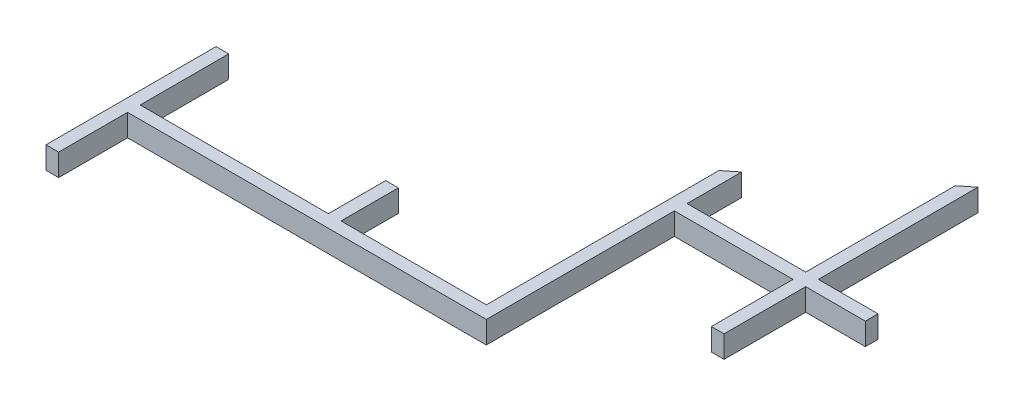
ISO-10303-21;
HEADER;
FILE_DESCRIPTION(('STEP AP214'),'2;1');
FILE_NAME('part.step','',(''),(''),'','','');
FILE_SCHEMA(('AUTOMOTIVE_DESIGN { 1 0 10303 214 1 1 1 1 }'));
ENDSEC;
DATA;
#1=APPLICATION_CONTEXT('core data for automotive mechanical design processes');
#2=APPLICATION_PROTOCOL_DEFINITION('international standard','automotive_design',2000,#1);
#3=PRODUCT_CONTEXT('',#1,'mechanical');
#4=PRODUCT('Part','Part','',(#3));
#5=PRODUCT_RELATED_PRODUCT_CATEGORY('part','',(#4));
#6=PRODUCT_DEFINITION_FORMATION('','',#4);
#7=PRODUCT_DEFINITION_CONTEXT('part definition',#1,'design');
#8=PRODUCT_DEFINITION('design','',#6,#7);
#9=PRODUCT_DEFINITION_SHAPE('','',#8);
#10=(LENGTH_UNIT() NAMED_UNIT(*) SI_UNIT(.MILLI.,.METRE.));
#11=(NAMED_UNIT(*) PLANE_ANGLE_UNIT() SI_UNIT($,.RADIAN.));
#12=(NAMED_UNIT(*) SI_UNIT($,.STERADIAN.) SOLID_ANGLE_UNIT());
#13=UNCERTAINTY_MEASURE_WITH_UNIT(LENGTH_MEASURE(1.E-05),#10,'distance_accuracy_value','');
#14=(GEOMETRIC_REPRESENTATION_CONTEXT(3) GLOBAL_UNCERTAINTY_ASSIGNED_CONTEXT((#13)) GLOBAL_UNIT_ASSIGNED_CONTEXT((#10,
#11,#12)) REPRESENTATION_CONTEXT('',''));
#15=CARTESIAN_POINT('',(0.,0.,0.));
#16=DIRECTION('',(0.,0.,1.));
#17=DIRECTION('',(1.,0.,0.));
#18=AXIS2_PLACEMENT_3D('',#15,#16,#17);
#19=CARTESIAN_POINT('',(40.0618679744798,-0.01,46.4845918549604));
#20=DIRECTION('',(0.624426731607843,0.,0.781083386619858));
#21=DIRECTION('',(0.781083386619858,0.,-0.624426731607843));
#22=AXIS2_PLACEMENT_3D('',#19,#20,#21);
#23=PLANE('',#22);
#24=DIRECTION('',(0.781083386619858,0.,-0.624426731607843));
#25=VECTOR('',#24,1.);
#26=CARTESIAN_POINT('',(38.2923721847623,0.,47.8991917446709));
#27=LINE('',#26,#25);
#28=CARTESIAN_POINT('',(47.3251652677286,0.,40.6780453745054));
#29=VERTEX_POINT('',#28);
#30=CARTESIAN_POINT('',(51.3251652677286,0.,37.48029854079));
#31=VERTEX_POINT('',#30);
#32=EDGE_CURVE('E242',#29,#31,#27,.T.);
#33=ORIENTED_EDGE('',*,*,#32,.F.);
#34=DIRECTION('',(0.,1.,0.));
#35=VECTOR('',#34,1.);
#36=CARTESIAN_POINT('',(47.3251652677286,7.,40.6780453745054));
#37=LINE('',#36,#35);
#38=CARTESIAN_POINT('',(47.3251652677286,7.,40.6780453745054));
#39=VERTEX_POINT('',#38);
#40=EDGE_CURVE('E379',#29,#39,#37,.T.);
#41=ORIENTED_EDGE('',*,*,#40,.T.);
#42=DIRECTION('',(0.781083386619858,0.,-0.624426731607843));
#43=VECTOR('',#42,1.);
#44=CARTESIAN_POINT('',(38.2923721847623,7.,47.8991917446709));
#45=LINE('',#44,#43);
#46=CARTESIAN_POINT('',(51.3251652677286,7.,37.48029854079));
#47=VERTEX_POINT('',#46);
#48=EDGE_CURVE('E50',#39,#47,#45,.T.);
#49=ORIENTED_EDGE('',*,*,#48,.T.);
#50=DIRECTION('',(0.,1.,0.));
#51=VECTOR('',#50,1.);
#52=CARTESIAN_POINT('',(51.3251652677286,7.,37.48029854079));
#53=LINE('',#52,#51);
#54=EDGE_CURVE('E45',#31,#47,#53,.T.);
#55=ORIENTED_EDGE('',*,*,#54,.F.);
#56=EDGE_LOOP('',(#33,#41,#49,#55));
#57=FACE_BOUND('',#56,.T.);
#58=ADVANCED_FACE('F42',(#57),#23,.F.);
#59=CARTESIAN_POINT('',(88.8387773673658,7.,7.49053996257907));
#60=VERTEX_POINT('',#59);
#61=CARTESIAN_POINT('',(92.8387773673658,7.,4.29279312886364));
#62=VERTEX_POINT('',#61);
#63=EDGE_CURVE('E11',#60,#62,#45,.T.);
#64=ORIENTED_EDGE('',*,*,#63,.T.);
#65=DIRECTION('',(0.,-1.,0.));
#66=VECTOR('',#65,1.);
#67=CARTESIAN_POINT('',(92.8387773673658,7.,4.29279312886366));
#68=LINE('',#67,#66);
#69=CARTESIAN_POINT('',(92.8387773673658,0.,4.29279312886364));
#70=VERTEX_POINT('',#69);
#71=EDGE_CURVE('E58',#62,#70,#68,.T.);
#72=ORIENTED_EDGE('',*,*,#71,.T.);
#73=CARTESIAN_POINT('',(88.8387773673658,0.,7.49053996257907));
#74=VERTEX_POINT('',#73);
#75=EDGE_CURVE('E312',#74,#70,#27,.T.);
#76=ORIENTED_EDGE('',*,*,#75,.F.);
#77=DIRECTION('',(0.,-1.,0.));
#78=VECTOR('',#77,1.);
#79=CARTESIAN_POINT('',(88.8387773673658,7.,7.49053996257909));
#80=LINE('',#79,#78);
#81=EDGE_CURVE('E380',#60,#74,#80,.T.);
#82=ORIENTED_EDGE('',*,*,#81,.F.);
#83=EDGE_LOOP('',(#64,#72,#76,#82));
#84=FACE_BOUND('',#83,.T.);
#85=ADVANCED_FACE('F486',(#84),#23,.F.);
#86=CARTESIAN_POINT('',(0.,7.,114.219108150174));
#87=DIRECTION('',(0.,0.,-1.));
#88=DIRECTION('',(-1.,0.,0.));
#89=AXIS2_PLACEMENT_3D('',#86,#87,#88);
#90=PLANE('',#89);
#91=DIRECTION('',(1.,0.,0.));
#92=VECTOR('',#91,1.);
#93=CARTESIAN_POINT('',(0.,0.,114.219108150174));
#94=LINE('',#93,#92);
#95=CARTESIAN_POINT('',(1.39906382550039,0.,114.219108150174));
#96=VERTEX_POINT('',#95);
#97=CARTESIAN_POINT('',(47.3251652677286,0.,114.219108150174));
#98=VERTEX_POINT('',#97);
#99=EDGE_CURVE('E272',#96,#98,#94,.T.);
#100=ORIENTED_EDGE('',*,*,#99,.F.);
#101=DIRECTION('',(0.,-1.,0.));
#102=VECTOR('',#101,1.);
#103=CARTESIAN_POINT('',(1.39906382550039,7.,114.219108150174));
#104=LINE('',#103,#102);
#105=CARTESIAN_POINT('',(1.39906382550039,7.,114.219108150174));
#106=VERTEX_POINT('',#105);
#107=EDGE_CURVE('E401',#106,#96,#104,.T.);
#108=ORIENTED_EDGE('',*,*,#107,.F.);
#109=DIRECTION('',(1.,0.,0.));
#110=VECTOR('',#109,1.);
#111=CARTESIAN_POINT('',(0.,7.,114.219108150174));
#112=LINE('',#111,#110);
#113=CARTESIAN_POINT('',(47.3251652677286,7.,114.219108150174));
#114=VERTEX_POINT('',#113);
#115=EDGE_CURVE('E340',#106,#114,#112,.T.);
#116=ORIENTED_EDGE('',*,*,#115,.T.);
#117=DIRECTION('',(0.,-1.,0.));
#118=VECTOR('',#117,1.);
#119=CARTESIAN_POINT('',(47.3251652677286,7.,114.219108150174));
#120=LINE('',#119,#118);
#121=EDGE_CURVE('E403',#114,#98,#120,.T.);
#122=ORIENTED_EDGE('',*,*,#121,.T.);
#123=EDGE_LOOP('',(#100,#108,#116,#122));
#124=FACE_BOUND('',#123,.T.);
#125=ADVANCED_FACE('F471',(#124),#90,.T.);
#126=CARTESIAN_POINT('',(1.39906382550039,7.,0.));
#127=DIRECTION('',(1.,0.,0.));
#128=DIRECTION('',(0.,0.,-1.));
#129=AXIS2_PLACEMENT_3D('',#126,#127,#128);
#130=PLANE('',#129);
#131=DIRECTION('',(0.,0.,1.));
#132=VECTOR('',#131,1.);
#133=CARTESIAN_POINT('',(1.39906382550039,0.,0.));
#134=LINE('',#133,#132);
#135=CARTESIAN_POINT('',(1.39906382550039,0.,96.1015176169608));
#136=VERTEX_POINT('',#135);
#137=EDGE_CURVE('E269',#136,#96,#134,.T.);
#138=ORIENTED_EDGE('',*,*,#137,.F.);
#139=DIRECTION('',(0.,-1.,0.));
#140=VECTOR('',#139,1.);
#141=CARTESIAN_POINT('',(1.39906382550039,7.,96.1015176169608));
#142=LINE('',#141,#140);
#143=CARTESIAN_POINT('',(1.39906382550039,7.,96.1015176169608));
#144=VERTEX_POINT('',#143);
#145=EDGE_CURVE('E399',#144,#136,#142,.T.);
#146=ORIENTED_EDGE('',*,*,#145,.F.);
#147=DIRECTION('',(0.,0.,1.));
#148=VECTOR('',#147,1.);
#149=CARTESIAN_POINT('',(1.39906382550039,7.,0.));
#150=LINE('',#149,#148);
#151=EDGE_CURVE('E337',#144,#106,#150,.T.);
#152=ORIENTED_EDGE('',*,*,#151,.T.);
#153=ORIENTED_EDGE('',*,*,#107,.T.);
#154=EDGE_LOOP('',(#138,#146,#152,#153));
#155=FACE_BOUND('',#154,.T.);
#156=ADVANCED_FACE('F467',(#155),#130,.T.);
#157=CARTESIAN_POINT('',(0.,7.,96.1015176169608));
#158=DIRECTION('',(0.,0.,-1.));
#159=DIRECTION('',(-1.,0.,0.));
#160=AXIS2_PLACEMENT_3D('',#157,#158,#159);
#161=PLANE('',#160);
#162=DIRECTION('',(1.,0.,0.));
#163=VECTOR('',#162,1.);
#164=CARTESIAN_POINT('',(0.,0.,96.1015176169608));
#165=LINE('',#164,#163);
#166=CARTESIAN_POINT('',(-2.60093617449961,0.,96.1015176169608));
#167=VERTEX_POINT('',#166);
#168=EDGE_CURVE('E266',#167,#136,#165,.T.);
#169=ORIENTED_EDGE('',*,*,#168,.F.);
#170=DIRECTION('',(0.,-1.,0.));
#171=VECTOR('',#170,1.);
#172=CARTESIAN_POINT('',(-2.60093617449961,7.,96.1015176169608));
#173=LINE('',#172,#171);
#174=CARTESIAN_POINT('',(-2.60093617449961,7.,96.1015176169608));
#175=VERTEX_POINT('',#174);
#176=EDGE_CURVE('E397',#175,#167,#173,.T.);
#177=ORIENTED_EDGE('',*,*,#176,.F.);
#178=DIRECTION('',(1.,0.,0.));
#179=VECTOR('',#178,1.);
#180=CARTESIAN_POINT('',(0.,7.,96.1015176169608));
#181=LINE('',#180,#179);
#182=EDGE_CURVE('E334',#175,#144,#181,.T.);
#183=ORIENTED_EDGE('',*,*,#182,.T.);
#184=ORIENTED_EDGE('',*,*,#145,.T.);
#185=EDGE_LOOP('',(#169,#177,#183,#184));
#186=FACE_BOUND('',#185,.T.);
#187=ADVANCED_FACE('F463',(#186),#161,.T.);
#188=CARTESIAN_POINT('',(-2.60093617449961,7.,0.));
#189=DIRECTION('',(-1.,0.,0.));
#190=DIRECTION('',(0.,0.,1.));
#191=AXIS2_PLACEMENT_3D('',#188,#189,#190);
#192=PLANE('',#191);
#193=DIRECTION('',(0.,0.,-1.));
#194=VECTOR('',#193,1.);
#195=CARTESIAN_POINT('',(-2.60093617449961,0.,0.));
#196=LINE('',#195,#194);
#197=CARTESIAN_POINT('',(-2.60093617449961,0.,114.219108150174));
#198=VERTEX_POINT('',#197);
#199=EDGE_CURVE('E263',#198,#167,#196,.T.);
#200=ORIENTED_EDGE('',*,*,#199,.F.);
#201=DIRECTION('',(0.,-1.,0.));
#202=VECTOR('',#201,1.);
#203=CARTESIAN_POINT('',(-2.60093617449961,7.,114.219108150174));
#204=LINE('',#203,#202);
#205=CARTESIAN_POINT('',(-2.60093617449961,7.,114.219108150174));
#206=VERTEX_POINT('',#205);
#207=EDGE_CURVE('E395',#206,#198,#204,.T.);
#208=ORIENTED_EDGE('',*,*,#207,.F.);
#209=DIRECTION('',(0.,0.,-1.));
#210=VECTOR('',#209,1.);
#211=CARTESIAN_POINT('',(-2.60093617449961,7.,0.));
#212=LINE('',#211,#210);
#213=EDGE_CURVE('E331',#206,#175,#212,.T.);
#214=ORIENTED_EDGE('',*,*,#213,.T.);
#215=ORIENTED_EDGE('',*,*,#176,.T.);
#216=EDGE_LOOP('',(#200,#208,#214,#215));
#217=FACE_BOUND('',#216,.T.);
#218=ADVANCED_FACE('F459',(#217),#192,.T.);
#219=CARTESIAN_POINT('',(0.,7.,114.219108150174));
#220=DIRECTION('',(0.,0.,-1.));
#221=DIRECTION('',(-1.,0.,0.));
#222=AXIS2_PLACEMENT_3D('',#219,#220,#221);
#223=PLANE('',#222);
#224=DIRECTION('',(1.,0.,0.));
#225=VECTOR('',#224,1.);
#226=CARTESIAN_POINT('',(0.,0.,114.219108150174));
#227=LINE('',#226,#225);
#228=CARTESIAN_POINT('',(-62.0964416968495,0.,114.219108150174));
#229=VERTEX_POINT('',#228);
#230=EDGE_CURVE('E260',#229,#198,#227,.T.);
#231=ORIENTED_EDGE('',*,*,#230,.F.);
#232=DIRECTION('',(0.,-1.,0.));
#233=VECTOR('',#232,1.);
#234=CARTESIAN_POINT('',(-62.0964416968495,7.,114.219108150174));
#235=LINE('',#234,#233);
#236=CARTESIAN_POINT('',(-62.0964416968495,7.,114.219108150174));
#237=VERTEX_POINT('',#236);
#238=EDGE_CURVE('E393',#237,#229,#235,.T.);
#239=ORIENTED_EDGE('',*,*,#238,.F.);
#240=DIRECTION('',(1.,0.,0.));
#241=VECTOR('',#240,1.);
#242=CARTESIAN_POINT('',(0.,7.,114.219108150174));
#243=LINE('',#242,#241);
#244=EDGE_CURVE('E328',#237,#206,#243,.T.);
#245=ORIENTED_EDGE('',*,*,#244,.T.);
#246=ORIENTED_EDGE('',*,*,#207,.T.);
#247=EDGE_LOOP('',(#231,#239,#245,#246));
#248=FACE_BOUND('',#247,.T.);
#249=ADVANCED_FACE('F455',(#248),#223,.T.);
#250=CARTESIAN_POINT('',(-62.0964416968495,7.,0.));
#251=DIRECTION('',(1.,0.,0.));
#252=DIRECTION('',(0.,0.,-1.));
#253=AXIS2_PLACEMENT_3D('',#250,#251,#252);
#254=PLANE('',#253);
#255=DIRECTION('',(0.,0.,1.));
#256=VECTOR('',#255,1.);
#257=CARTESIAN_POINT('',(-62.0964416968495,0.,0.));
#258=LINE('',#257,#256);
#259=CARTESIAN_POINT('',(-62.0964416968495,0.,86.2448382475305));
#260=VERTEX_POINT('',#259);
#261=EDGE_CURVE('E257',#260,#229,#258,.T.);
#262=ORIENTED_EDGE('',*,*,#261,.F.);
#263=DIRECTION('',(0.,-1.,0.));
#264=VECTOR('',#263,1.);
#265=CARTESIAN_POINT('',(-62.0964416968495,7.,86.2448382475305));
#266=LINE('',#265,#264);
#267=CARTESIAN_POINT('',(-62.0964416968495,7.,86.2448382475305));
#268=VERTEX_POINT('',#267);
#269=EDGE_CURVE('E391',#268,#260,#266,.T.);
#270=ORIENTED_EDGE('',*,*,#269,.F.);
#271=DIRECTION('',(0.,0.,1.));
#272=VECTOR('',#271,1.);
#273=CARTESIAN_POINT('',(-62.0964416968495,7.,0.));
#274=LINE('',#273,#272);
#275=EDGE_CURVE('E325',#268,#237,#274,.T.);
#276=ORIENTED_EDGE('',*,*,#275,.T.);
#277=ORIENTED_EDGE('',*,*,#238,.T.);
#278=EDGE_LOOP('',(#262,#270,#276,#277));
#279=FACE_BOUND('',#278,.T.);
#280=ADVANCED_FACE('F451',(#279),#254,.T.);
#281=CARTESIAN_POINT('',(0.,7.,86.2448382475305));
#282=DIRECTION('',(0.,0.,-1.));
#283=DIRECTION('',(-1.,0.,0.));
#284=AXIS2_PLACEMENT_3D('',#281,#282,#283);
#285=PLANE('',#284);
#286=DIRECTION('',(1.,0.,0.));
#287=VECTOR('',#286,1.);
#288=CARTESIAN_POINT('',(0.,0.,86.2448382475305));
#289=LINE('',#288,#287);
#290=CARTESIAN_POINT('',(-66.0964416968495,0.,86.2448382475305));
#291=VERTEX_POINT('',#290);
#292=EDGE_CURVE('E254',#291,#260,#289,.T.);
#293=ORIENTED_EDGE('',*,*,#292,.F.);
#294=DIRECTION('',(0.,-1.,0.));
#295=VECTOR('',#294,1.);
#296=CARTESIAN_POINT('',(-66.0964416968495,7.,86.2448382475305));
#297=LINE('',#296,#295);
#298=CARTESIAN_POINT('',(-66.0964416968495,7.,86.2448382475305));
#299=VERTEX_POINT('',#298);
#300=EDGE_CURVE('E389',#299,#291,#297,.T.);
#301=ORIENTED_EDGE('',*,*,#300,.F.);
#302=DIRECTION('',(1.,0.,0.));
#303=VECTOR('',#302,1.);
#304=CARTESIAN_POINT('',(0.,7.,86.2448382475305));
#305=LINE('',#304,#303);
#306=EDGE_CURVE('E322',#299,#268,#305,.T.);
#307=ORIENTED_EDGE('',*,*,#306,.T.);
#308=ORIENTED_EDGE('',*,*,#269,.T.);
#309=EDGE_LOOP('',(#293,#301,#307,#308));
#310=FACE_BOUND('',#309,.T.);
#311=ADVANCED_FACE('F449',(#310),#285,.T.);
#312=CARTESIAN_POINT('',(-66.0964416968495,7.,0.));
#313=DIRECTION('',(-1.,0.,0.));
#314=DIRECTION('',(0.,0.,1.));
#315=AXIS2_PLACEMENT_3D('',#312,#313,#314);
#316=PLANE('',#315);
#317=DIRECTION('',(0.,0.,-1.));
#318=VECTOR('',#317,1.);
#319=CARTESIAN_POINT('',(-66.0964416968495,0.,0.));
#320=LINE('',#319,#318);
#321=CARTESIAN_POINT('',(-66.0964416968495,0.,140.));
#322=VERTEX_POINT('',#321);
#323=EDGE_CURVE('E251',#322,#291,#320,.T.);
#324=ORIENTED_EDGE('',*,*,#323,.F.);
#325=DIRECTION('',(0.,-1.,0.));
#326=VECTOR('',#325,1.);
#327=CARTESIAN_POINT('',(-66.0964416968495,7.,140.));
#328=LINE('',#327,#326);
#329=CARTESIAN_POINT('',(-66.0964416968495,7.,140.));
#330=VERTEX_POINT('',#329);
#331=EDGE_CURVE('E315',#330,#322,#328,.T.);
#332=ORIENTED_EDGE('',*,*,#331,.F.);
#333=DIRECTION('',(0.,0.,-1.));
#334=VECTOR('',#333,1.);
#335=CARTESIAN_POINT('',(-66.0964416968495,7.,0.));
#336=LINE('',#335,#334);
#337=EDGE_CURVE('E319',#330,#299,#336,.T.);
#338=ORIENTED_EDGE('',*,*,#337,.T.);
#339=ORIENTED_EDGE('',*,*,#300,.T.);
#340=EDGE_LOOP('',(#324,#332,#338,#339));
#341=FACE_BOUND('',#340,.T.);
#342=ADVANCED_FACE('F445',(#341),#316,.T.);
#343=CARTESIAN_POINT('',(0.,7.,140.));
#344=DIRECTION('',(0.,0.,1.));
#345=DIRECTION('',(1.,0.,0.));
#346=AXIS2_PLACEMENT_3D('',#343,#344,#345);
#347=PLANE('',#346);
#348=DIRECTION('',(-1.,0.,0.));
#349=VECTOR('',#348,1.);
#350=CARTESIAN_POINT('',(0.,0.,140.));
#351=LINE('',#350,#349);
#352=CARTESIAN_POINT('',(-62.0964416968495,0.,140.));
#353=VERTEX_POINT('',#352);
#354=EDGE_CURVE('E309',#353,#322,#351,.T.);
#355=ORIENTED_EDGE('',*,*,#354,.F.);
#356=DIRECTION('',(0.,-1.,0.));
#357=VECTOR('',#356,1.);
#358=CARTESIAN_POINT('',(-62.0964416968495,7.,140.));
#359=LINE('',#358,#357);
#360=CARTESIAN_POINT('',(-62.0964416968495,7.,140.));
#361=VERTEX_POINT('',#360);
#362=EDGE_CURVE('E236',#361,#353,#359,.T.);
#363=ORIENTED_EDGE('',*,*,#362,.F.);
#364=DIRECTION('',(-1.,0.,0.));
#365=VECTOR('',#364,1.);
#366=CARTESIAN_POINT('',(0.,7.,140.));
#367=LINE('',#366,#365);
#368=EDGE_CURVE('E243',#361,#330,#367,.T.);
#369=ORIENTED_EDGE('',*,*,#368,.T.);
#370=ORIENTED_EDGE('',*,*,#331,.T.);
#371=EDGE_LOOP('',(#355,#363,#369,#370));
#372=FACE_BOUND('',#371,.T.);
#373=ADVANCED_FACE('F433',(#372),#347,.T.);
#374=CARTESIAN_POINT('',(-62.0964416968495,7.,0.));
#375=DIRECTION('',(1.,0.,0.));
#376=DIRECTION('',(0.,0.,-1.));
#377=AXIS2_PLACEMENT_3D('',#374,#375,#376);
#378=PLANE('',#377);
#379=DIRECTION('',(0.,0.,1.));
#380=VECTOR('',#379,1.);
#381=CARTESIAN_POINT('',(-62.0964416968495,0.,0.));
#382=LINE('',#381,#380);
#383=CARTESIAN_POINT('',(-62.0964416968495,0.,118.219108150174));
#384=VERTEX_POINT('',#383);
#385=EDGE_CURVE('E306',#384,#353,#382,.T.);
#386=ORIENTED_EDGE('',*,*,#385,.F.);
#387=DIRECTION('',(0.,-1.,0.));
#388=VECTOR('',#387,1.);
#389=CARTESIAN_POINT('',(-62.0964416968495,7.,118.219108150174));
#390=LINE('',#389,#388);
#391=CARTESIAN_POINT('',(-62.0964416968495,7.,118.219108150174));
#392=VERTEX_POINT('',#391);
#393=EDGE_CURVE('E424',#392,#384,#390,.T.);
#394=ORIENTED_EDGE('',*,*,#393,.F.);
#395=DIRECTION('',(0.,0.,1.));
#396=VECTOR('',#395,1.);
#397=CARTESIAN_POINT('',(-62.0964416968495,7.,0.));
#398=LINE('',#397,#396);
#399=EDGE_CURVE('E246',#392,#361,#398,.T.);
#400=ORIENTED_EDGE('',*,*,#399,.T.);
#401=ORIENTED_EDGE('',*,*,#362,.T.);
#402=EDGE_LOOP('',(#386,#394,#400,#401));
#403=FACE_BOUND('',#402,.T.);
#404=ADVANCED_FACE('F429',(#403),#378,.T.);
#405=CARTESIAN_POINT('',(0.,7.,118.219108150174));
#406=DIRECTION('',(0.,0.,1.));
#407=DIRECTION('',(1.,0.,0.));
#408=AXIS2_PLACEMENT_3D('',#405,#406,#407);
#409=PLANE('',#408);
#410=DIRECTION('',(-1.,0.,0.));
#411=VECTOR('',#410,1.);
#412=CARTESIAN_POINT('',(0.,0.,118.219108150174));
#413=LINE('',#412,#411);
#414=CARTESIAN_POINT('',(51.3251652677286,0.,118.219108150174));
#415=VERTEX_POINT('',#414);
#416=EDGE_CURVE('E303',#415,#384,#413,.T.);
#417=ORIENTED_EDGE('',*,*,#416,.F.);
#418=DIRECTION('',(0.,-1.,0.));
#419=VECTOR('',#418,1.);
#420=CARTESIAN_POINT('',(51.3251652677286,7.,118.219108150174));
#421=LINE('',#420,#419);
#422=CARTESIAN_POINT('',(51.3251652677286,7.,118.219108150174));
#423=VERTEX_POINT('',#422);
#424=EDGE_CURVE('E422',#423,#415,#421,.T.);
#425=ORIENTED_EDGE('',*,*,#424,.F.);
#426=DIRECTION('',(-1.,0.,0.));
#427=VECTOR('',#426,1.);
#428=CARTESIAN_POINT('',(0.,7.,118.219108150174));
#429=LINE('',#428,#427);
#430=EDGE_CURVE('E372',#423,#392,#429,.T.);
#431=ORIENTED_EDGE('',*,*,#430,.T.);
#432=ORIENTED_EDGE('',*,*,#393,.T.);
#433=EDGE_LOOP('',(#417,#425,#431,#432));
#434=FACE_BOUND('',#433,.T.);
#435=ADVANCED_FACE('F438',(#434),#409,.T.);
#436=CARTESIAN_POINT('',(51.3251652677286,7.,0.));
#437=DIRECTION('',(1.,0.,0.));
#438=DIRECTION('',(0.,0.,-1.));
#439=AXIS2_PLACEMENT_3D('',#436,#437,#438);
#440=PLANE('',#439);
#441=DIRECTION('',(0.,0.,1.));
#442=VECTOR('',#441,1.);
#443=CARTESIAN_POINT('',(51.3251652677286,0.,0.));
#444=LINE('',#443,#442);
#445=CARTESIAN_POINT('',(51.3251652677286,0.,58.7665459719618));
#446=VERTEX_POINT('',#445);
#447=EDGE_CURVE('E300',#446,#415,#444,.T.);
#448=ORIENTED_EDGE('',*,*,#447,.F.);
#449=DIRECTION('',(0.,-1.,0.));
#450=VECTOR('',#449,1.);
#451=CARTESIAN_POINT('',(51.3251652677286,7.,58.7665459719618));
#452=LINE('',#451,#450);
#453=CARTESIAN_POINT('',(51.3251652677286,7.,58.7665459719618));
#454=VERTEX_POINT('',#453);
#455=EDGE_CURVE('E420',#454,#446,#452,.T.);
#456=ORIENTED_EDGE('',*,*,#455,.F.);
#457=DIRECTION('',(0.,0.,1.));
#458=VECTOR('',#457,1.);
#459=CARTESIAN_POINT('',(51.3251652677286,7.,0.));
#460=LINE('',#459,#458);
#461=EDGE_CURVE('E369',#454,#423,#460,.T.);
#462=ORIENTED_EDGE('',*,*,#461,.T.);
#463=ORIENTED_EDGE('',*,*,#424,.T.);
#464=EDGE_LOOP('',(#448,#456,#462,#463));
#465=FACE_BOUND('',#464,.T.);
#466=ADVANCED_FACE('F577',(#465),#440,.T.);
#467=CARTESIAN_POINT('',(0.,7.,58.7665459719618));
#468=DIRECTION('',(0.,0.,1.));
#469=DIRECTION('',(1.,0.,0.));
#470=AXIS2_PLACEMENT_3D('',#467,#468,#469);
#471=PLANE('',#470);
#472=DIRECTION('',(-1.,0.,0.));
#473=VECTOR('',#472,1.);
#474=CARTESIAN_POINT('',(0.,0.,58.7665459719618));
#475=LINE('',#474,#473);
#476=CARTESIAN_POINT('',(88.8387773673658,0.,58.7665459719618));
#477=VERTEX_POINT('',#476);
#478=EDGE_CURVE('E297',#477,#446,#475,.T.);
#479=ORIENTED_EDGE('',*,*,#478,.F.);
#480=DIRECTION('',(0.,-1.,0.));
#481=VECTOR('',#480,1.);
#482=CARTESIAN_POINT('',(88.8387773673658,7.,58.7665459719618));
#483=LINE('',#482,#481);
#484=CARTESIAN_POINT('',(88.8387773673658,7.,58.7665459719618));
#485=VERTEX_POINT('',#484);
#486=EDGE_CURVE('E418',#485,#477,#483,.T.);
#487=ORIENTED_EDGE('',*,*,#486,.F.);
#488=DIRECTION('',(-1.,0.,0.));
#489=VECTOR('',#488,1.);
#490=CARTESIAN_POINT('',(0.,7.,58.7665459719618));
#491=LINE('',#490,#489);
#492=EDGE_CURVE('E366',#485,#454,#491,.T.);
#493=ORIENTED_EDGE('',*,*,#492,.T.);
#494=ORIENTED_EDGE('',*,*,#455,.T.);
#495=EDGE_LOOP('',(#479,#487,#493,#494));
#496=FACE_BOUND('',#495,.T.);
#497=ADVANCED_FACE('F585',(#496),#471,.T.);
#498=CARTESIAN_POINT('',(88.8387773673657,7.,0.));
#499=DIRECTION('',(-1.,0.,0.));
#500=DIRECTION('',(0.,0.,1.));
#501=AXIS2_PLACEMENT_3D('',#498,#499,#500);
#502=PLANE('',#501);
#503=DIRECTION('',(0.,0.,-1.));
#504=VECTOR('',#503,1.);
#505=CARTESIAN_POINT('',(88.8387773673657,0.,0.));
#506=LINE('',#505,#504);
#507=CARTESIAN_POINT('',(88.8387773673658,0.,84.5818118750103));
#508=VERTEX_POINT('',#507);
#509=EDGE_CURVE('E294',#508,#477,#506,.T.);
#510=ORIENTED_EDGE('',*,*,#509,.F.);
#511=DIRECTION('',(0.,-1.,0.));
#512=VECTOR('',#511,1.);
#513=CARTESIAN_POINT('',(88.8387773673658,7.,84.5818118750103));
#514=LINE('',#513,#512);
#515=CARTESIAN_POINT('',(88.8387773673658,7.,84.5818118750103));
#516=VERTEX_POINT('',#515);
#517=EDGE_CURVE('E416',#516,#508,#514,.T.);
#518=ORIENTED_EDGE('',*,*,#517,.F.);
#519=DIRECTION('',(0.,0.,-1.));
#520=VECTOR('',#519,1.);
#521=CARTESIAN_POINT('',(88.8387773673657,7.,0.));
#522=LINE('',#521,#520);
#523=EDGE_CURVE('E363',#516,#485,#522,.T.);
#524=ORIENTED_EDGE('',*,*,#523,.T.);
#525=ORIENTED_EDGE('',*,*,#486,.T.);
#526=EDGE_LOOP('',(#510,#518,#524,#525));
#527=FACE_BOUND('',#526,.T.);
#528=ADVANCED_FACE('F594',(#527),#502,.T.);
#529=CARTESIAN_POINT('',(0.,7.,84.5818118750103));
#530=DIRECTION('',(0.,0.,1.));
#531=DIRECTION('',(1.,0.,0.));
#532=AXIS2_PLACEMENT_3D('',#529,#530,#531);
#533=PLANE('',#532);
#534=DIRECTION('',(-1.,0.,0.));
#535=VECTOR('',#534,1.);
#536=CARTESIAN_POINT('',(0.,0.,84.5818118750103));
#537=LINE('',#536,#535);
#538=CARTESIAN_POINT('',(92.8387773673658,0.,84.5818118750103));
#539=VERTEX_POINT('',#538);
#540=EDGE_CURVE('E291',#539,#508,#537,.T.);
#541=ORIENTED_EDGE('',*,*,#540,.F.);
#542=DIRECTION('',(0.,-1.,0.));
#543=VECTOR('',#542,1.);
#544=CARTESIAN_POINT('',(92.8387773673658,7.,84.5818118750103));
#545=LINE('',#544,#543);
#546=CARTESIAN_POINT('',(92.8387773673658,7.,84.5818118750103));
#547=VERTEX_POINT('',#546);
#548=EDGE_CURVE('E414',#547,#539,#545,.T.);
#549=ORIENTED_EDGE('',*,*,#548,.F.);
#550=DIRECTION('',(-1.,0.,0.));
#551=VECTOR('',#550,1.);
#552=CARTESIAN_POINT('',(0.,7.,84.5818118750103));
#553=LINE('',#552,#551);
#554=EDGE_CURVE('E360',#547,#516,#553,.T.);
#555=ORIENTED_EDGE('',*,*,#554,.T.);
#556=ORIENTED_EDGE('',*,*,#517,.T.);
#557=EDGE_LOOP('',(#541,#549,#555,#556));
#558=FACE_BOUND('',#557,.T.);
#559=ADVANCED_FACE('F603',(#558),#533,.T.);
#560=CARTESIAN_POINT('',(92.8387773673658,7.,0.));
#561=DIRECTION('',(1.,0.,0.));
#562=DIRECTION('',(0.,0.,-1.));
#563=AXIS2_PLACEMENT_3D('',#560,#561,#562);
#564=PLANE('',#563);
#565=DIRECTION('',(0.,0.,1.));
#566=VECTOR('',#565,1.);
#567=CARTESIAN_POINT('',(92.8387773673658,0.,0.));
#568=LINE('',#567,#566);
#569=CARTESIAN_POINT('',(92.8387773673658,0.,58.7665459719618));
#570=VERTEX_POINT('',#569);
#571=EDGE_CURVE('E288',#570,#539,#568,.T.);
#572=ORIENTED_EDGE('',*,*,#571,.F.);
#573=DIRECTION('',(0.,-1.,0.));
#574=VECTOR('',#573,1.);
#575=CARTESIAN_POINT('',(92.8387773673658,7.,58.7665459719618));
#576=LINE('',#575,#574);
#577=CARTESIAN_POINT('',(92.8387773673658,7.,58.7665459719618));
#578=VERTEX_POINT('',#577);
#579=EDGE_CURVE('E412',#578,#570,#576,.T.);
#580=ORIENTED_EDGE('',*,*,#579,.F.);
#581=DIRECTION('',(0.,0.,1.));
#582=VECTOR('',#581,1.);
#583=CARTESIAN_POINT('',(92.8387773673658,7.,0.));
#584=LINE('',#583,#582);
#585=EDGE_CURVE('E357',#578,#547,#584,.T.);
#586=ORIENTED_EDGE('',*,*,#585,.T.);
#587=ORIENTED_EDGE('',*,*,#548,.T.);
#588=EDGE_LOOP('',(#572,#580,#586,#587));
#589=FACE_BOUND('',#588,.T.);
#590=ADVANCED_FACE('F612',(#589),#564,.T.);
#591=CARTESIAN_POINT('',(0.,7.,58.7665459719618));
#592=DIRECTION('',(0.,0.,1.));
#593=DIRECTION('',(1.,0.,0.));
#594=AXIS2_PLACEMENT_3D('',#591,#592,#593);
#595=PLANE('',#594);
#596=DIRECTION('',(-1.,0.,0.));
#597=VECTOR('',#596,1.);
#598=CARTESIAN_POINT('',(0.,0.,58.7665459719618));
#599=LINE('',#598,#597);
#600=CARTESIAN_POINT('',(111.70281367071,0.,58.7665459719618));
#601=VERTEX_POINT('',#600);
#602=EDGE_CURVE('E285',#601,#570,#599,.T.);
#603=ORIENTED_EDGE('',*,*,#602,.F.);
#604=DIRECTION('',(0.,-1.,0.));
#605=VECTOR('',#604,1.);
#606=CARTESIAN_POINT('',(111.70281367071,7.,58.7665459719618));
#607=LINE('',#606,#605);
#608=CARTESIAN_POINT('',(111.70281367071,7.,58.7665459719618));
#609=VERTEX_POINT('',#608);
#610=EDGE_CURVE('E410',#609,#601,#607,.T.);
#611=ORIENTED_EDGE('',*,*,#610,.F.);
#612=DIRECTION('',(-1.,0.,0.));
#613=VECTOR('',#612,1.);
#614=CARTESIAN_POINT('',(0.,7.,58.7665459719618));
#615=LINE('',#614,#613);
#616=EDGE_CURVE('E354',#609,#578,#615,.T.);
#617=ORIENTED_EDGE('',*,*,#616,.T.);
#618=ORIENTED_EDGE('',*,*,#579,.T.);
#619=EDGE_LOOP('',(#603,#611,#617,#618));
#620=FACE_BOUND('',#619,.T.);
#621=ADVANCED_FACE('F621',(#620),#595,.T.);
#622=CARTESIAN_POINT('',(111.70281367071,7.,0.));
#623=DIRECTION('',(1.,0.,0.));
#624=DIRECTION('',(0.,0.,-1.));
#625=AXIS2_PLACEMENT_3D('',#622,#623,#624);
#626=PLANE('',#625);
#627=DIRECTION('',(0.,0.,1.));
#628=VECTOR('',#627,1.);
#629=CARTESIAN_POINT('',(111.70281367071,0.,0.));
#630=LINE('',#629,#628);
#631=CARTESIAN_POINT('',(111.70281367071,0.,54.7665459719618));
#632=VERTEX_POINT('',#631);
#633=EDGE_CURVE('E282',#632,#601,#630,.T.);
#634=ORIENTED_EDGE('',*,*,#633,.F.);
#635=DIRECTION('',(0.,-1.,0.));
#636=VECTOR('',#635,1.);
#637=CARTESIAN_POINT('',(111.70281367071,7.,54.7665459719618));
#638=LINE('',#637,#636);
#639=CARTESIAN_POINT('',(111.70281367071,7.,54.7665459719618));
#640=VERTEX_POINT('',#639);
#641=EDGE_CURVE('E408',#640,#632,#638,.T.);
#642=ORIENTED_EDGE('',*,*,#641,.F.);
#643=DIRECTION('',(0.,0.,1.));
#644=VECTOR('',#643,1.);
#645=CARTESIAN_POINT('',(111.70281367071,7.,0.));
#646=LINE('',#645,#644);
#647=EDGE_CURVE('E351',#640,#609,#646,.T.);
#648=ORIENTED_EDGE('',*,*,#647,.T.);
#649=ORIENTED_EDGE('',*,*,#610,.T.);
#650=EDGE_LOOP('',(#634,#642,#648,#649));
#651=FACE_BOUND('',#650,.T.);
#652=ADVANCED_FACE('F630',(#651),#626,.T.);
#653=CARTESIAN_POINT('',(0.,7.,54.7665459719618));
#654=DIRECTION('',(0.,0.,-1.));
#655=DIRECTION('',(-1.,0.,0.));
#656=AXIS2_PLACEMENT_3D('',#653,#654,#655);
#657=PLANE('',#656);
#658=DIRECTION('',(1.,0.,0.));
#659=VECTOR('',#658,1.);
#660=CARTESIAN_POINT('',(0.,0.,54.7665459719618));
#661=LINE('',#660,#659);
#662=CARTESIAN_POINT('',(92.8387773673658,0.,54.7665459719618));
#663=VERTEX_POINT('',#662);
#664=EDGE_CURVE('E279',#663,#632,#661,.T.);
#665=ORIENTED_EDGE('',*,*,#664,.F.);
#666=DIRECTION('',(0.,-1.,0.));
#667=VECTOR('',#666,1.);
#668=CARTESIAN_POINT('',(92.8387773673658,7.,54.7665459719618));
#669=LINE('',#668,#667);
#670=CARTESIAN_POINT('',(92.8387773673658,7.,54.7665459719618));
#671=VERTEX_POINT('',#670);
#672=EDGE_CURVE('E405',#671,#663,#669,.T.);
#673=ORIENTED_EDGE('',*,*,#672,.F.);
#674=DIRECTION('',(1.,0.,0.));
#675=VECTOR('',#674,1.);
#676=CARTESIAN_POINT('',(0.,7.,54.7665459719618));
#677=LINE('',#676,#675);
#678=EDGE_CURVE('E348',#671,#640,#677,.T.);
#679=ORIENTED_EDGE('',*,*,#678,.T.);
#680=ORIENTED_EDGE('',*,*,#641,.T.);
#681=EDGE_LOOP('',(#665,#673,#679,#680));
#682=FACE_BOUND('',#681,.T.);
#683=ADVANCED_FACE('F639',(#682),#657,.T.);
#684=CARTESIAN_POINT('',(92.8387773673658,7.,0.));
#685=DIRECTION('',(1.,0.,0.));
#686=DIRECTION('',(0.,0.,-1.));
#687=AXIS2_PLACEMENT_3D('',#684,#685,#686);
#688=PLANE('',#687);
#689=ORIENTED_EDGE('',*,*,#71,.F.);
#690=DIRECTION('',(0.,0.,1.));
#691=VECTOR('',#690,1.);
#692=CARTESIAN_POINT('',(92.8387773673658,7.,0.));
#693=LINE('',#692,#691);
#694=EDGE_CURVE('E346',#62,#671,#693,.T.);
#695=ORIENTED_EDGE('',*,*,#694,.T.);
#696=ORIENTED_EDGE('',*,*,#672,.T.);
#697=DIRECTION('',(0.,0.,1.));
#698=VECTOR('',#697,1.);
#699=CARTESIAN_POINT('',(92.8387773673658,0.,0.));
#700=LINE('',#699,#698);
#701=EDGE_CURVE('E277',#70,#663,#700,.T.);
#702=ORIENTED_EDGE('',*,*,#701,.F.);
#703=EDGE_LOOP('',(#689,#695,#696,#702));
#704=FACE_BOUND('',#703,.T.);
#705=ADVANCED_FACE('F504',(#704),#688,.T.);
#706=CARTESIAN_POINT('',(88.8387773673658,7.,0.));
#707=DIRECTION('',(1.,0.,0.));
#708=DIRECTION('',(0.,0.,-1.));
#709=AXIS2_PLACEMENT_3D('',#706,#707,#708);
#710=PLANE('',#709);
#711=DIRECTION('',(0.,0.,1.));
#712=VECTOR('',#711,1.);
#713=CARTESIAN_POINT('',(88.8387773673658,7.,0.));
#714=LINE('',#713,#712);
#715=CARTESIAN_POINT('',(88.8387773673658,7.,54.7665459719618));
#716=VERTEX_POINT('',#715);
#717=EDGE_CURVE('E317',#60,#716,#714,.T.);
#718=ORIENTED_EDGE('',*,*,#717,.F.);
#719=ORIENTED_EDGE('',*,*,#81,.T.);
#720=DIRECTION('',(0.,0.,1.));
#721=VECTOR('',#720,1.);
#722=CARTESIAN_POINT('',(88.8387773673658,0.,0.));
#723=LINE('',#722,#721);
#724=CARTESIAN_POINT('',(88.8387773673658,0.,54.7665459719618));
#725=VERTEX_POINT('',#724);
#726=EDGE_CURVE('E229',#74,#725,#723,.T.);
#727=ORIENTED_EDGE('',*,*,#726,.T.);
#728=DIRECTION('',(0.,-1.,0.));
#729=VECTOR('',#728,1.);
#730=CARTESIAN_POINT('',(88.8387773673658,7.,54.7665459719618));
#731=LINE('',#730,#729);
#732=EDGE_CURVE('E225',#716,#725,#731,.T.);
#733=ORIENTED_EDGE('',*,*,#732,.F.);
#734=EDGE_LOOP('',(#718,#719,#727,#733));
#735=FACE_BOUND('',#734,.T.);
#736=ADVANCED_FACE('F386',(#735),#710,.F.);
#737=CARTESIAN_POINT('',(0.,7.,54.7665459719618));
#738=DIRECTION('',(0.,0.,1.));
#739=DIRECTION('',(1.,0.,0.));
#740=AXIS2_PLACEMENT_3D('',#737,#738,#739);
#741=PLANE('',#740);
#742=DIRECTION('',(-1.,0.,0.));
#743=VECTOR('',#742,1.);
#744=CARTESIAN_POINT('',(0.,0.,54.7665459719618));
#745=LINE('',#744,#743);
#746=CARTESIAN_POINT('',(51.3251652677286,0.,54.7665459719618));
#747=VERTEX_POINT('',#746);
#748=EDGE_CURVE('E218',#725,#747,#745,.T.);
#749=ORIENTED_EDGE('',*,*,#748,.T.);
#750=DIRECTION('',(0.,-1.,0.));
#751=VECTOR('',#750,1.);
#752=CARTESIAN_POINT('',(51.3251652677286,7.,54.7665459719618));
#753=LINE('',#752,#751);
#754=CARTESIAN_POINT('',(51.3251652677286,7.,54.7665459719618));
#755=VERTEX_POINT('',#754);
#756=EDGE_CURVE('E222',#755,#747,#753,.T.);
#757=ORIENTED_EDGE('',*,*,#756,.F.);
#758=DIRECTION('',(-1.,0.,0.));
#759=VECTOR('',#758,1.);
#760=CARTESIAN_POINT('',(0.,7.,54.7665459719618));
#761=LINE('',#760,#759);
#762=EDGE_CURVE('E314',#716,#755,#761,.T.);
#763=ORIENTED_EDGE('',*,*,#762,.F.);
#764=ORIENTED_EDGE('',*,*,#732,.T.);
#765=EDGE_LOOP('',(#749,#757,#763,#764));
#766=FACE_BOUND('',#765,.T.);
#767=ADVANCED_FACE('F220',(#766),#741,.F.);
#768=CARTESIAN_POINT('',(51.3251652677286,7.,0.));
#769=DIRECTION('',(-1.,0.,0.));
#770=DIRECTION('',(0.,0.,1.));
#771=AXIS2_PLACEMENT_3D('',#768,#769,#770);
#772=PLANE('',#771);
#773=DIRECTION('',(0.,0.,-1.));
#774=VECTOR('',#773,1.);
#775=CARTESIAN_POINT('',(51.3251652677286,0.,0.));
#776=LINE('',#775,#774);
#777=EDGE_CURVE('E230',#747,#31,#776,.T.);
#778=ORIENTED_EDGE('',*,*,#777,.T.);
#779=ORIENTED_EDGE('',*,*,#54,.T.);
#780=DIRECTION('',(0.,0.,-1.));
#781=VECTOR('',#780,1.);
#782=CARTESIAN_POINT('',(51.3251652677286,7.,0.));
#783=LINE('',#782,#781);
#784=EDGE_CURVE('E235',#755,#47,#783,.T.);
#785=ORIENTED_EDGE('',*,*,#784,.F.);
#786=ORIENTED_EDGE('',*,*,#756,.T.);
#787=EDGE_LOOP('',(#778,#779,#785,#786));
#788=FACE_BOUND('',#787,.T.);
#789=ADVANCED_FACE('F234',(#788),#772,.F.);
#790=CARTESIAN_POINT('',(47.3251652677286,7.,0.));
#791=DIRECTION('',(-1.,0.,0.));
#792=DIRECTION('',(0.,0.,1.));
#793=AXIS2_PLACEMENT_3D('',#790,#791,#792);
#794=PLANE('',#793);
#795=ORIENTED_EDGE('',*,*,#40,.F.);
#796=DIRECTION('',(0.,0.,-1.));
#797=VECTOR('',#796,1.);
#798=CARTESIAN_POINT('',(47.3251652677286,0.,0.));
#799=LINE('',#798,#797);
#800=EDGE_CURVE('E275',#98,#29,#799,.T.);
#801=ORIENTED_EDGE('',*,*,#800,.F.);
#802=ORIENTED_EDGE('',*,*,#121,.F.);
#803=DIRECTION('',(0.,0.,-1.));
#804=VECTOR('',#803,1.);
#805=CARTESIAN_POINT('',(47.3251652677286,7.,0.));
#806=LINE('',#805,#804);
#807=EDGE_CURVE('E343',#114,#39,#806,.T.);
#808=ORIENTED_EDGE('',*,*,#807,.T.);
#809=EDGE_LOOP('',(#795,#801,#802,#808));
#810=FACE_BOUND('',#809,.T.);
#811=ADVANCED_FACE('F474',(#810),#794,.T.);
#812=CARTESIAN_POINT('',(0.,0.,0.));
#813=DIRECTION('',(0.,1.,0.));
#814=DIRECTION('',(0.,0.,1.));
#815=AXIS2_PLACEMENT_3D('',#812,#813,#814);
#816=PLANE('',#815);
#817=ORIENTED_EDGE('',*,*,#800,.T.);
#818=ORIENTED_EDGE('',*,*,#32,.T.);
#819=ORIENTED_EDGE('',*,*,#777,.F.);
#820=ORIENTED_EDGE('',*,*,#748,.F.);
#821=ORIENTED_EDGE('',*,*,#726,.F.);
#822=ORIENTED_EDGE('',*,*,#75,.T.);
#823=ORIENTED_EDGE('',*,*,#701,.T.);
#824=ORIENTED_EDGE('',*,*,#664,.T.);
#825=ORIENTED_EDGE('',*,*,#633,.T.);
#826=ORIENTED_EDGE('',*,*,#602,.T.);
#827=ORIENTED_EDGE('',*,*,#571,.T.);
#828=ORIENTED_EDGE('',*,*,#540,.T.);
#829=ORIENTED_EDGE('',*,*,#509,.T.);
#830=ORIENTED_EDGE('',*,*,#478,.T.);
#831=ORIENTED_EDGE('',*,*,#447,.T.);
#832=ORIENTED_EDGE('',*,*,#416,.T.);
#833=ORIENTED_EDGE('',*,*,#385,.T.);
#834=ORIENTED_EDGE('',*,*,#354,.T.);
#835=ORIENTED_EDGE('',*,*,#323,.T.);
#836=ORIENTED_EDGE('',*,*,#292,.T.);
#837=ORIENTED_EDGE('',*,*,#261,.T.);
#838=ORIENTED_EDGE('',*,*,#230,.T.);
#839=ORIENTED_EDGE('',*,*,#199,.T.);
#840=ORIENTED_EDGE('',*,*,#168,.T.);
#841=ORIENTED_EDGE('',*,*,#137,.T.);
#842=ORIENTED_EDGE('',*,*,#99,.T.);
#843=EDGE_LOOP('',(#817,#818,#819,#820,#821,#822,#823,#824,#825,#826,#827,#828,#829,#830,#831,
#832,#833,#834,#835,#836,#837,#838,#839,#840,#841,#842));
#844=FACE_BOUND('',#843,.T.);
#845=ADVANCED_FACE('F240',(#844),#816,.F.);
#846=CARTESIAN_POINT('',(0.,7.,0.));
#847=DIRECTION('',(0.,1.,0.));
#848=DIRECTION('',(0.,0.,1.));
#849=AXIS2_PLACEMENT_3D('',#846,#847,#848);
#850=PLANE('',#849);
#851=ORIENTED_EDGE('',*,*,#48,.F.);
#852=ORIENTED_EDGE('',*,*,#807,.F.);
#853=ORIENTED_EDGE('',*,*,#115,.F.);
#854=ORIENTED_EDGE('',*,*,#151,.F.);
#855=ORIENTED_EDGE('',*,*,#182,.F.);
#856=ORIENTED_EDGE('',*,*,#213,.F.);
#857=ORIENTED_EDGE('',*,*,#244,.F.);
#858=ORIENTED_EDGE('',*,*,#275,.F.);
#859=ORIENTED_EDGE('',*,*,#306,.F.);
#860=ORIENTED_EDGE('',*,*,#337,.F.);
#861=ORIENTED_EDGE('',*,*,#368,.F.);
#862=ORIENTED_EDGE('',*,*,#399,.F.);
#863=ORIENTED_EDGE('',*,*,#430,.F.);
#864=ORIENTED_EDGE('',*,*,#461,.F.);
#865=ORIENTED_EDGE('',*,*,#492,.F.);
#866=ORIENTED_EDGE('',*,*,#523,.F.);
#867=ORIENTED_EDGE('',*,*,#554,.F.);
#868=ORIENTED_EDGE('',*,*,#585,.F.);
#869=ORIENTED_EDGE('',*,*,#616,.F.);
#870=ORIENTED_EDGE('',*,*,#647,.F.);
#871=ORIENTED_EDGE('',*,*,#678,.F.);
#872=ORIENTED_EDGE('',*,*,#694,.F.);
#873=ORIENTED_EDGE('',*,*,#63,.F.);
#874=ORIENTED_EDGE('',*,*,#717,.T.);
#875=ORIENTED_EDGE('',*,*,#762,.T.);
#876=ORIENTED_EDGE('',*,*,#784,.T.);
#877=EDGE_LOOP('',(#851,#852,#853,#854,#855,#856,#857,#858,#859,#860,#861,#862,#863,#864,#865,
#866,#867,#868,#869,#870,#871,#872,#873,#874,#875,#876));
#878=FACE_BOUND('',#877,.T.);
#879=ADVANCED_FACE('F382',(#878),#850,.T.);
#880=CLOSED_SHELL('',(#58,#85,#125,#156,#187,#218,#249,#280,#311,#342,#373,#404,#435,#466,#497,
#528,#559,#590,#621,#652,#683,#705,#736,#767,#789,#811,#845,#879));
#881=MANIFOLD_SOLID_BREP('B2',#880);
#882=ADVANCED_BREP_SHAPE_REPRESENTATION('',(#18,#881),#14);
#883=SHAPE_DEFINITION_REPRESENTATION(#9,#882);
ENDSEC;
END-ISO-10303-21;
